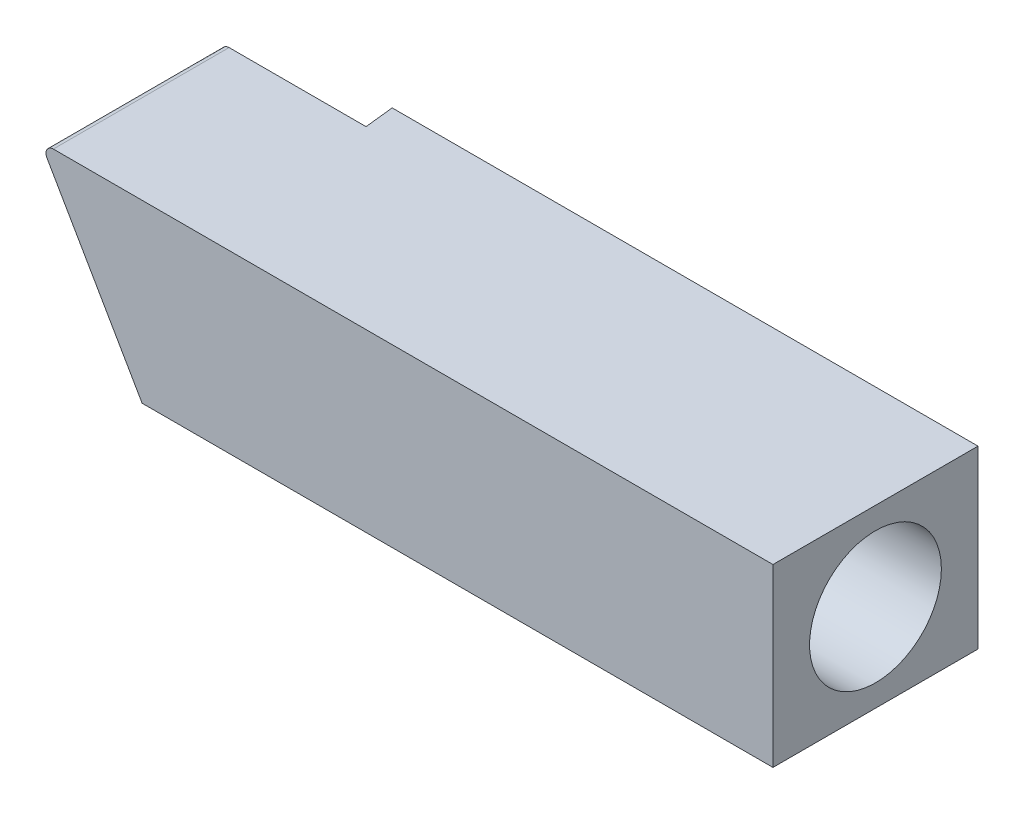
ISO-10303-21;
HEADER;
FILE_DESCRIPTION(('STEP AP214'),'2;1');
FILE_NAME('part.step','',(''),(''),'','','');
FILE_SCHEMA(('AUTOMOTIVE_DESIGN { 1 0 10303 214 1 1 1 1 }'));
ENDSEC;
DATA;
#1=APPLICATION_CONTEXT('core data for automotive mechanical design processes');
#2=APPLICATION_PROTOCOL_DEFINITION('international standard','automotive_design',2000,#1);
#3=PRODUCT_CONTEXT('',#1,'mechanical');
#4=PRODUCT('Part','Part','',(#3));
#5=PRODUCT_RELATED_PRODUCT_CATEGORY('part','',(#4));
#6=PRODUCT_DEFINITION_FORMATION('','',#4);
#7=PRODUCT_DEFINITION_CONTEXT('part definition',#1,'design');
#8=PRODUCT_DEFINITION('design','',#6,#7);
#9=PRODUCT_DEFINITION_SHAPE('','',#8);
#10=(LENGTH_UNIT() NAMED_UNIT(*) SI_UNIT(.MILLI.,.METRE.));
#11=(NAMED_UNIT(*) PLANE_ANGLE_UNIT() SI_UNIT($,.RADIAN.));
#12=(NAMED_UNIT(*) SI_UNIT($,.STERADIAN.) SOLID_ANGLE_UNIT());
#13=UNCERTAINTY_MEASURE_WITH_UNIT(LENGTH_MEASURE(1.E-05),#10,'distance_accuracy_value','');
#14=(GEOMETRIC_REPRESENTATION_CONTEXT(3) GLOBAL_UNCERTAINTY_ASSIGNED_CONTEXT((#13)) GLOBAL_UNIT_ASSIGNED_CONTEXT((#10,
#11,#12)) REPRESENTATION_CONTEXT('',''));
#15=CARTESIAN_POINT('',(0.,0.,0.));
#16=DIRECTION('',(0.,0.,1.));
#17=DIRECTION('',(1.,0.,0.));
#18=AXIS2_PLACEMENT_3D('',#15,#16,#17);
#19=CARTESIAN_POINT('',(-22.6462978133218,12.,14.));
#20=DIRECTION('',(0.86602540378444,0.499999999999998,0.));
#21=DIRECTION('',(-0.499999999999998,0.86602540378444,0.));
#22=AXIS2_PLACEMENT_3D('',#19,#20,#21);
#23=PLANE('',#22);
#24=DIRECTION('',(0.499999999999998,-0.86602540378444,0.));
#25=VECTOR('',#24,1.);
#26=CARTESIAN_POINT('',(-22.6462978133218,12.,14.));
#27=LINE('',#26,#25);
#28=CARTESIAN_POINT('',(-22.2132851114296,11.25,14.));
#29=VERTEX_POINT('',#28);
#30=CARTESIAN_POINT('',(-15.7180945830463,0.,14.));
#31=VERTEX_POINT('',#30);
#32=EDGE_CURVE('E117',#29,#31,#27,.T.);
#33=ORIENTED_EDGE('',*,*,#32,.F.);
#34=DIRECTION('',(0.,0.,-1.));
#35=VECTOR('',#34,1.);
#36=CARTESIAN_POINT('',(-22.2132851114296,11.25,14.));
#37=LINE('',#36,#35);
#38=CARTESIAN_POINT('',(-22.2132851114296,11.25,2.));
#39=VERTEX_POINT('',#38);
#40=EDGE_CURVE('E139',#29,#39,#37,.T.);
#41=ORIENTED_EDGE('',*,*,#40,.T.);
#42=DIRECTION('',(0.499999999999998,-0.86602540378444,0.));
#43=VECTOR('',#42,1.);
#44=CARTESIAN_POINT('',(-22.6462978133218,12.,2.));
#45=LINE('',#44,#43);
#46=CARTESIAN_POINT('',(-15.7180945830463,0.,2.));
#47=VERTEX_POINT('',#46);
#48=EDGE_CURVE('E114',#39,#47,#45,.T.);
#49=ORIENTED_EDGE('',*,*,#48,.T.);
#50=DIRECTION('',(0.,0.,-1.));
#51=VECTOR('',#50,1.);
#52=CARTESIAN_POINT('',(-15.7180945830463,0.,14.));
#53=LINE('',#52,#51);
#54=EDGE_CURVE('E134',#31,#47,#53,.T.);
#55=ORIENTED_EDGE('',*,*,#54,.F.);
#56=EDGE_LOOP('',(#33,#41,#49,#55));
#57=FACE_BOUND('',#56,.T.);
#58=ADVANCED_FACE('F31',(#57),#23,.F.);
#59=CARTESIAN_POINT('',(-15.7180945830463,0.,14.));
#60=DIRECTION('',(0.,1.,0.));
#61=DIRECTION('',(-1.,0.,0.));
#62=AXIS2_PLACEMENT_3D('',#59,#60,#61);
#63=PLANE('',#62);
#64=DIRECTION('',(1.,0.,0.));
#65=VECTOR('',#64,1.);
#66=CARTESIAN_POINT('',(-15.7180945830463,0.,2.));
#67=LINE('',#66,#65);
#68=CARTESIAN_POINT('',(-12.4275391064762,0.,2.));
#69=VERTEX_POINT('',#68);
#70=EDGE_CURVE('E112',#47,#69,#67,.T.);
#71=ORIENTED_EDGE('',*,*,#70,.T.);
#72=DIRECTION('',(-0.108730867738232,0.,-0.994071224008064));
#73=VECTOR('',#72,1.);
#74=CARTESIAN_POINT('',(-11.1694066534443,0.,13.5024674553379));
#75=LINE('',#74,#73);
#76=CARTESIAN_POINT('',(-12.6462978133218,0.,0.));
#77=VERTEX_POINT('',#76);
#78=EDGE_CURVE('E101',#69,#77,#75,.T.);
#79=ORIENTED_EDGE('',*,*,#78,.T.);
#80=DIRECTION('',(1.,0.,0.));
#81=VECTOR('',#80,1.);
#82=CARTESIAN_POINT('',(-15.7180945830463,0.,0.));
#83=LINE('',#82,#81);
#84=CARTESIAN_POINT('',(27.3537021866782,0.,0.));
#85=VERTEX_POINT('',#84);
#86=EDGE_CURVE('E116',#77,#85,#83,.T.);
#87=ORIENTED_EDGE('',*,*,#86,.T.);
#88=DIRECTION('',(0.,0.,-1.));
#89=VECTOR('',#88,1.);
#90=CARTESIAN_POINT('',(27.3537021866782,0.,14.));
#91=LINE('',#90,#89);
#92=CARTESIAN_POINT('',(27.3537021866782,0.,14.));
#93=VERTEX_POINT('',#92);
#94=EDGE_CURVE('E131',#93,#85,#91,.T.);
#95=ORIENTED_EDGE('',*,*,#94,.F.);
#96=DIRECTION('',(1.,0.,0.));
#97=VECTOR('',#96,1.);
#98=CARTESIAN_POINT('',(-15.7180945830463,0.,14.));
#99=LINE('',#98,#97);
#100=EDGE_CURVE('E119',#31,#93,#99,.T.);
#101=ORIENTED_EDGE('',*,*,#100,.F.);
#102=ORIENTED_EDGE('',*,*,#54,.T.);
#103=EDGE_LOOP('',(#71,#79,#87,#95,#101,#102));
#104=FACE_BOUND('',#103,.T.);
#105=ADVANCED_FACE('F150',(#104),#63,.F.);
#106=CARTESIAN_POINT('',(27.3537021866782,12.,14.));
#107=DIRECTION('',(-1.,0.,0.));
#108=DIRECTION('',(0.,0.,1.));
#109=AXIS2_PLACEMENT_3D('',#106,#107,#108);
#110=PLANE('',#109);
#111=CARTESIAN_POINT('',(27.3537021866782,6.,7.));
#112=DIRECTION('',(1.,0.,0.));
#113=DIRECTION('',(0.,0.,-1.));
#114=AXIS2_PLACEMENT_3D('',#111,#112,#113);
#115=CIRCLE('',#114,4.5);
#116=CARTESIAN_POINT('',(27.3537021866782,6.,2.5));
#117=VERTEX_POINT('',#116);
#118=EDGE_CURVE('E192',#117,#117,#115,.T.);
#119=ORIENTED_EDGE('',*,*,#118,.F.);
#120=EDGE_LOOP('',(#119));
#121=FACE_BOUND('',#120,.T.);
#122=DIRECTION('',(0.,1.,0.));
#123=VECTOR('',#122,1.);
#124=CARTESIAN_POINT('',(27.3537021866782,12.,0.));
#125=LINE('',#124,#123);
#126=CARTESIAN_POINT('',(27.3537021866782,12.,0.));
#127=VERTEX_POINT('',#126);
#128=EDGE_CURVE('E127',#85,#127,#125,.T.);
#129=ORIENTED_EDGE('',*,*,#128,.T.);
#130=DIRECTION('',(0.,0.,-1.));
#131=VECTOR('',#130,1.);
#132=CARTESIAN_POINT('',(27.3537021866782,12.,14.));
#133=LINE('',#132,#131);
#134=CARTESIAN_POINT('',(27.3537021866782,12.,14.));
#135=VERTEX_POINT('',#134);
#136=EDGE_CURVE('E125',#135,#127,#133,.T.);
#137=ORIENTED_EDGE('',*,*,#136,.F.);
#138=DIRECTION('',(0.,1.,0.));
#139=VECTOR('',#138,1.);
#140=CARTESIAN_POINT('',(27.3537021866782,12.,14.));
#141=LINE('',#140,#139);
#142=EDGE_CURVE('E121',#93,#135,#141,.T.);
#143=ORIENTED_EDGE('',*,*,#142,.F.);
#144=ORIENTED_EDGE('',*,*,#94,.T.);
#145=EDGE_LOOP('',(#129,#137,#143,#144));
#146=FACE_BOUND('',#145,.T.);
#147=ADVANCED_FACE('F170',(#121,#146),#110,.F.);
#148=CARTESIAN_POINT('',(-22.6462978133218,12.,14.));
#149=DIRECTION('',(0.,-1.,0.));
#150=DIRECTION('',(0.,0.,-1.));
#151=AXIS2_PLACEMENT_3D('',#148,#149,#150);
#152=PLANE('',#151);
#153=DIRECTION('',(1.,0.,0.));
#154=VECTOR('',#153,1.);
#155=CARTESIAN_POINT('',(-22.6462978133218,12.,2.));
#156=LINE('',#155,#154);
#157=CARTESIAN_POINT('',(-21.7802724095373,12.,2.));
#158=VERTEX_POINT('',#157);
#159=CARTESIAN_POINT('',(-12.4275391064762,12.,2.));
#160=VERTEX_POINT('',#159);
#161=EDGE_CURVE('E87',#158,#160,#156,.T.);
#162=ORIENTED_EDGE('',*,*,#161,.F.);
#163=DIRECTION('',(0.,0.,-1.));
#164=VECTOR('',#163,1.);
#165=CARTESIAN_POINT('',(-21.7802724095373,12.,14.));
#166=LINE('',#165,#164);
#167=CARTESIAN_POINT('',(-21.7802724095373,12.,14.));
#168=VERTEX_POINT('',#167);
#169=EDGE_CURVE('E39',#158,#168,#166,.F.);
#170=ORIENTED_EDGE('',*,*,#169,.T.);
#171=DIRECTION('',(-1.,0.,0.));
#172=VECTOR('',#171,1.);
#173=CARTESIAN_POINT('',(-22.6462978133218,12.,14.));
#174=LINE('',#173,#172);
#175=EDGE_CURVE('E123',#135,#168,#174,.T.);
#176=ORIENTED_EDGE('',*,*,#175,.F.);
#177=ORIENTED_EDGE('',*,*,#136,.T.);
#178=DIRECTION('',(-1.,0.,0.));
#179=VECTOR('',#178,1.);
#180=CARTESIAN_POINT('',(-22.6462978133218,12.,0.));
#181=LINE('',#180,#179);
#182=CARTESIAN_POINT('',(-12.6462978133218,12.,0.));
#183=VERTEX_POINT('',#182);
#184=EDGE_CURVE('E107',#127,#183,#181,.T.);
#185=ORIENTED_EDGE('',*,*,#184,.T.);
#186=DIRECTION('',(-0.108730867738232,0.,-0.994071224008064));
#187=VECTOR('',#186,1.);
#188=CARTESIAN_POINT('',(-12.6462978133218,12.,0.));
#189=LINE('',#188,#187);
#190=EDGE_CURVE('E94',#160,#183,#189,.T.);
#191=ORIENTED_EDGE('',*,*,#190,.F.);
#192=EDGE_LOOP('',(#162,#170,#176,#177,#185,#191));
#193=FACE_BOUND('',#192,.T.);
#194=ADVANCED_FACE('F104',(#193),#152,.F.);
#195=CARTESIAN_POINT('',(-15.7180945830463,0.,14.));
#196=DIRECTION('',(0.,0.,1.));
#197=DIRECTION('',(1.,0.,0.));
#198=AXIS2_PLACEMENT_3D('',#195,#196,#197);
#199=PLANE('',#198);
#200=ORIENTED_EDGE('',*,*,#175,.T.);
#201=CARTESIAN_POINT('',(-21.7802724095373,11.5,14.));
#202=DIRECTION('',(0.,0.,1.));
#203=DIRECTION('',(1.,0.,0.));
#204=AXIS2_PLACEMENT_3D('',#201,#202,#203);
#205=CIRCLE('',#204,0.5);
#206=EDGE_CURVE('E11',#168,#29,#205,.T.);
#207=ORIENTED_EDGE('',*,*,#206,.T.);
#208=ORIENTED_EDGE('',*,*,#32,.T.);
#209=ORIENTED_EDGE('',*,*,#100,.T.);
#210=ORIENTED_EDGE('',*,*,#142,.T.);
#211=EDGE_LOOP('',(#200,#207,#208,#209,#210));
#212=FACE_BOUND('',#211,.T.);
#213=ADVANCED_FACE('F154',(#212),#199,.T.);
#214=CARTESIAN_POINT('',(-15.7180945830463,0.,0.));
#215=DIRECTION('',(0.,0.,1.));
#216=DIRECTION('',(1.,0.,0.));
#217=AXIS2_PLACEMENT_3D('',#214,#215,#216);
#218=PLANE('',#217);
#219=ORIENTED_EDGE('',*,*,#86,.F.);
#220=DIRECTION('',(0.,1.,0.));
#221=VECTOR('',#220,1.);
#222=CARTESIAN_POINT('',(-12.6462978133218,0.,0.));
#223=LINE('',#222,#221);
#224=EDGE_CURVE('E137',#77,#183,#223,.T.);
#225=ORIENTED_EDGE('',*,*,#224,.T.);
#226=ORIENTED_EDGE('',*,*,#184,.F.);
#227=ORIENTED_EDGE('',*,*,#128,.F.);
#228=EDGE_LOOP('',(#219,#225,#226,#227));
#229=FACE_BOUND('',#228,.T.);
#230=ADVANCED_FACE('F178',(#229),#218,.F.);
#231=CARTESIAN_POINT('',(-22.6462978133218,-2.,2.));
#232=DIRECTION('',(0.,0.,1.));
#233=DIRECTION('',(1.,0.,0.));
#234=AXIS2_PLACEMENT_3D('',#231,#232,#233);
#235=PLANE('',#234);
#236=ORIENTED_EDGE('',*,*,#48,.F.);
#237=CARTESIAN_POINT('',(-21.7802724095373,11.5,2.));
#238=DIRECTION('',(0.,0.,1.));
#239=DIRECTION('',(1.,0.,0.));
#240=AXIS2_PLACEMENT_3D('',#237,#238,#239);
#241=CIRCLE('',#240,0.5);
#242=EDGE_CURVE('E53',#39,#158,#241,.F.);
#243=ORIENTED_EDGE('',*,*,#242,.T.);
#244=ORIENTED_EDGE('',*,*,#161,.T.);
#245=DIRECTION('',(0.,1.,0.));
#246=VECTOR('',#245,1.);
#247=CARTESIAN_POINT('',(-12.4275391064762,-2.,2.));
#248=LINE('',#247,#246);
#249=EDGE_CURVE('E91',#69,#160,#248,.T.);
#250=ORIENTED_EDGE('',*,*,#249,.F.);
#251=ORIENTED_EDGE('',*,*,#70,.F.);
#252=EDGE_LOOP('',(#236,#243,#244,#250,#251));
#253=FACE_BOUND('',#252,.T.);
#254=ADVANCED_FACE('F89',(#253),#235,.F.);
#255=CARTESIAN_POINT('',(-12.6462978133218,-2.,0.));
#256=DIRECTION('',(0.994071224008064,0.,-0.108730867738232));
#257=DIRECTION('',(-0.108730867738232,0.,-0.994071224008064));
#258=AXIS2_PLACEMENT_3D('',#255,#256,#257);
#259=PLANE('',#258);
#260=ORIENTED_EDGE('',*,*,#249,.T.);
#261=ORIENTED_EDGE('',*,*,#190,.T.);
#262=ORIENTED_EDGE('',*,*,#224,.F.);
#263=ORIENTED_EDGE('',*,*,#78,.F.);
#264=EDGE_LOOP('',(#260,#261,#262,#263));
#265=FACE_BOUND('',#264,.T.);
#266=ADVANCED_FACE('F98',(#265),#259,.F.);
#267=CARTESIAN_POINT('',(-21.7802724095373,11.5,14.));
#268=DIRECTION('',(0.,0.,-1.));
#269=DIRECTION('',(-1.,0.,0.));
#270=AXIS2_PLACEMENT_3D('',#267,#268,#269);
#271=CYLINDRICAL_SURFACE('',#270,0.5);
#272=ORIENTED_EDGE('',*,*,#206,.F.);
#273=ORIENTED_EDGE('',*,*,#169,.F.);
#274=ORIENTED_EDGE('',*,*,#242,.F.);
#275=ORIENTED_EDGE('',*,*,#40,.F.);
#276=EDGE_LOOP('',(#272,#273,#274,#275));
#277=FACE_BOUND('',#276,.T.);
#278=ADVANCED_FACE('F33',(#277),#271,.T.);
#279=CARTESIAN_POINT('',(2.35370218667821,6.,7.));
#280=DIRECTION('',(1.,0.,0.));
#281=DIRECTION('',(0.,0.,-1.));
#282=AXIS2_PLACEMENT_3D('',#279,#280,#281);
#283=CYLINDRICAL_SURFACE('',#282,4.5);
#284=CARTESIAN_POINT('',(2.35370218667821,6.,7.));
#285=DIRECTION('',(1.,0.,0.));
#286=DIRECTION('',(0.,0.,-1.));
#287=AXIS2_PLACEMENT_3D('',#284,#285,#286);
#288=CIRCLE('',#287,4.5);
#289=CARTESIAN_POINT('',(2.35370218667821,6.,2.5));
#290=VERTEX_POINT('',#289);
#291=EDGE_CURVE('E95',#290,#290,#288,.T.);
#292=ORIENTED_EDGE('',*,*,#291,.F.);
#293=EDGE_LOOP('',(#292));
#294=FACE_BOUND('',#293,.T.);
#295=ORIENTED_EDGE('',*,*,#118,.T.);
#296=EDGE_LOOP('',(#295));
#297=FACE_BOUND('',#296,.T.);
#298=ADVANCED_FACE('F157',(#294,#297),#283,.F.);
#299=CARTESIAN_POINT('',(2.35370218667821,6.,7.));
#300=DIRECTION('',(1.,0.,0.));
#301=DIRECTION('',(0.,0.,-1.));
#302=AXIS2_PLACEMENT_3D('',#299,#300,#301);
#303=PLANE('',#302);
#304=ORIENTED_EDGE('',*,*,#291,.T.);
#305=EDGE_LOOP('',(#304));
#306=FACE_BOUND('',#305,.T.);
#307=ADVANCED_FACE('F162',(#306),#303,.T.);
#308=CLOSED_SHELL('',(#58,#105,#147,#194,#213,#230,#254,#266,#278,#298,#307));
#309=MANIFOLD_SOLID_BREP('B2',#308);
#310=ADVANCED_BREP_SHAPE_REPRESENTATION('',(#18,#309),#14);
#311=SHAPE_DEFINITION_REPRESENTATION(#9,#310);
ENDSEC;
END-ISO-10303-21;
